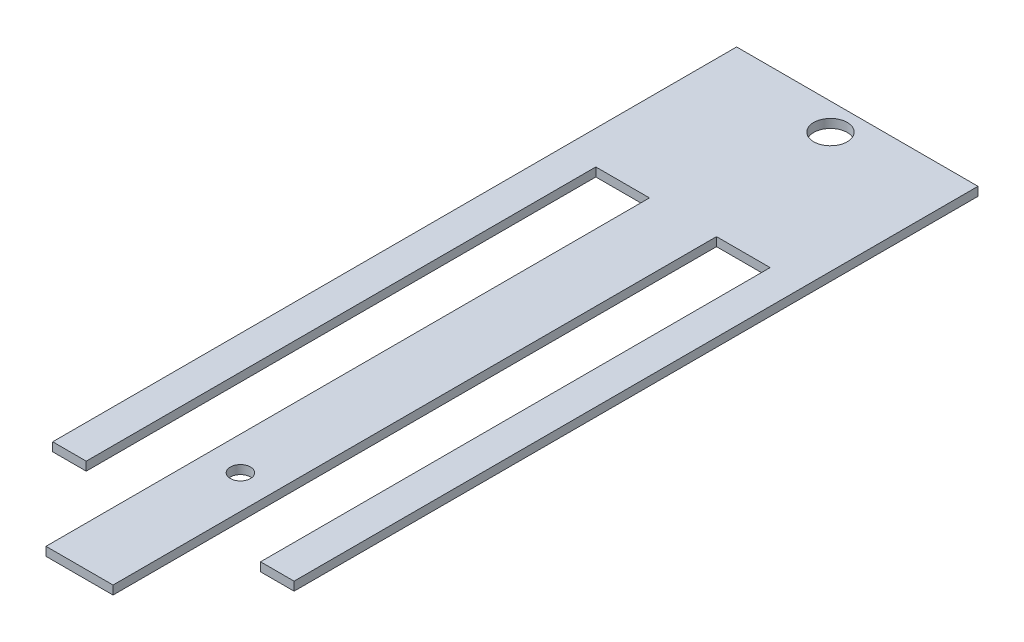
ISO-10303-21;
HEADER;
FILE_DESCRIPTION(('STEP AP214'),'2;1');
FILE_NAME('part.step','',(''),(''),'','','');
FILE_SCHEMA(('AUTOMOTIVE_DESIGN { 1 0 10303 214 1 1 1 1 }'));
ENDSEC;
DATA;
#1=APPLICATION_CONTEXT('core data for automotive mechanical design processes');
#2=APPLICATION_PROTOCOL_DEFINITION('international standard','automotive_design',2000,#1);
#3=PRODUCT_CONTEXT('',#1,'mechanical');
#4=PRODUCT('Part','Part','',(#3));
#5=PRODUCT_RELATED_PRODUCT_CATEGORY('part','',(#4));
#6=PRODUCT_DEFINITION_FORMATION('','',#4);
#7=PRODUCT_DEFINITION_CONTEXT('part definition',#1,'design');
#8=PRODUCT_DEFINITION('design','',#6,#7);
#9=PRODUCT_DEFINITION_SHAPE('','',#8);
#10=(LENGTH_UNIT() NAMED_UNIT(*) SI_UNIT(.MILLI.,.METRE.));
#11=(NAMED_UNIT(*) PLANE_ANGLE_UNIT() SI_UNIT($,.RADIAN.));
#12=(NAMED_UNIT(*) SI_UNIT($,.STERADIAN.) SOLID_ANGLE_UNIT());
#13=UNCERTAINTY_MEASURE_WITH_UNIT(LENGTH_MEASURE(1.E-05),#10,'distance_accuracy_value','');
#14=(GEOMETRIC_REPRESENTATION_CONTEXT(3) GLOBAL_UNCERTAINTY_ASSIGNED_CONTEXT((#13)) GLOBAL_UNIT_ASSIGNED_CONTEXT((#10,
#11,#12)) REPRESENTATION_CONTEXT('',''));
#15=CARTESIAN_POINT('',(0.,0.,0.));
#16=DIRECTION('',(0.,0.,1.));
#17=DIRECTION('',(1.,0.,0.));
#18=AXIS2_PLACEMENT_3D('',#15,#16,#17);
#19=CARTESIAN_POINT('',(-6.5,0.65,0.));
#20=DIRECTION('',(-1.,0.,0.));
#21=DIRECTION('',(0.,0.,1.));
#22=AXIS2_PLACEMENT_3D('',#19,#20,#21);
#23=PLANE('',#22);
#24=DIRECTION('',(0.,0.,-1.));
#25=VECTOR('',#24,1.);
#26=CARTESIAN_POINT('',(-6.5,0.,0.));
#27=LINE('',#26,#25);
#28=CARTESIAN_POINT('',(-6.5,0.,22.));
#29=VERTEX_POINT('',#28);
#30=CARTESIAN_POINT('',(-6.5,0.,-16.));
#31=VERTEX_POINT('',#30);
#32=EDGE_CURVE('E158',#29,#31,#27,.T.);
#33=ORIENTED_EDGE('',*,*,#32,.T.);
#34=DIRECTION('',(0.,-1.,0.));
#35=VECTOR('',#34,1.);
#36=CARTESIAN_POINT('',(-6.5,0.65,-16.));
#37=LINE('',#36,#35);
#38=CARTESIAN_POINT('',(-6.5,0.65,-16.));
#39=VERTEX_POINT('',#38);
#40=EDGE_CURVE('E11',#39,#31,#37,.T.);
#41=ORIENTED_EDGE('',*,*,#40,.F.);
#42=DIRECTION('',(0.,0.,-1.));
#43=VECTOR('',#42,1.);
#44=CARTESIAN_POINT('',(-6.5,0.65,0.));
#45=LINE('',#44,#43);
#46=CARTESIAN_POINT('',(-6.5,0.65,22.));
#47=VERTEX_POINT('',#46);
#48=EDGE_CURVE('E182',#47,#39,#45,.T.);
#49=ORIENTED_EDGE('',*,*,#48,.F.);
#50=DIRECTION('',(0.,-1.,0.));
#51=VECTOR('',#50,1.);
#52=CARTESIAN_POINT('',(-6.5,0.65,22.));
#53=LINE('',#52,#51);
#54=EDGE_CURVE('E154',#47,#29,#53,.T.);
#55=ORIENTED_EDGE('',*,*,#54,.T.);
#56=EDGE_LOOP('',(#33,#41,#49,#55));
#57=FACE_BOUND('',#56,.T.);
#58=ADVANCED_FACE('F37',(#57),#23,.F.);
#59=CARTESIAN_POINT('',(0.,0.65,-16.));
#60=DIRECTION('',(0.,0.,-1.));
#61=DIRECTION('',(-1.,0.,0.));
#62=AXIS2_PLACEMENT_3D('',#59,#60,#61);
#63=PLANE('',#62);
#64=DIRECTION('',(1.,0.,0.));
#65=VECTOR('',#64,1.);
#66=CARTESIAN_POINT('',(0.,0.,-16.));
#67=LINE('',#66,#65);
#68=CARTESIAN_POINT('',(-2.5,0.,-16.));
#69=VERTEX_POINT('',#68);
#70=EDGE_CURVE('E161',#31,#69,#67,.T.);
#71=ORIENTED_EDGE('',*,*,#70,.T.);
#72=DIRECTION('',(0.,-1.,0.));
#73=VECTOR('',#72,1.);
#74=CARTESIAN_POINT('',(-2.5,0.65,-16.));
#75=LINE('',#74,#73);
#76=CARTESIAN_POINT('',(-2.5,0.65,-16.));
#77=VERTEX_POINT('',#76);
#78=EDGE_CURVE('E46',#77,#69,#75,.T.);
#79=ORIENTED_EDGE('',*,*,#78,.F.);
#80=DIRECTION('',(1.,0.,0.));
#81=VECTOR('',#80,1.);
#82=CARTESIAN_POINT('',(0.,0.65,-16.));
#83=LINE('',#82,#81);
#84=EDGE_CURVE('E109',#39,#77,#83,.T.);
#85=ORIENTED_EDGE('',*,*,#84,.F.);
#86=ORIENTED_EDGE('',*,*,#40,.T.);
#87=EDGE_LOOP('',(#71,#79,#85,#86));
#88=FACE_BOUND('',#87,.T.);
#89=ADVANCED_FACE('F259',(#88),#63,.F.);
#90=CARTESIAN_POINT('',(-2.5,0.65,0.));
#91=DIRECTION('',(1.,0.,0.));
#92=DIRECTION('',(0.,0.,-1.));
#93=AXIS2_PLACEMENT_3D('',#90,#91,#92);
#94=PLANE('',#93);
#95=DIRECTION('',(0.,0.,1.));
#96=VECTOR('',#95,1.);
#97=CARTESIAN_POINT('',(-2.5,0.,0.));
#98=LINE('',#97,#96);
#99=CARTESIAN_POINT('',(-2.5,0.,29.));
#100=VERTEX_POINT('',#99);
#101=EDGE_CURVE('E163',#69,#100,#98,.T.);
#102=ORIENTED_EDGE('',*,*,#101,.T.);
#103=DIRECTION('',(0.,-1.,0.));
#104=VECTOR('',#103,1.);
#105=CARTESIAN_POINT('',(-2.5,0.65,29.));
#106=LINE('',#105,#104);
#107=CARTESIAN_POINT('',(-2.5,0.65,29.));
#108=VERTEX_POINT('',#107);
#109=EDGE_CURVE('E199',#108,#100,#106,.T.);
#110=ORIENTED_EDGE('',*,*,#109,.F.);
#111=DIRECTION('',(0.,0.,1.));
#112=VECTOR('',#111,1.);
#113=CARTESIAN_POINT('',(-2.5,0.65,0.));
#114=LINE('',#113,#112);
#115=EDGE_CURVE('E208',#77,#108,#114,.T.);
#116=ORIENTED_EDGE('',*,*,#115,.F.);
#117=ORIENTED_EDGE('',*,*,#78,.T.);
#118=EDGE_LOOP('',(#102,#110,#116,#117));
#119=FACE_BOUND('',#118,.T.);
#120=ADVANCED_FACE('F206',(#119),#94,.F.);
#121=CARTESIAN_POINT('',(0.,0.65,29.));
#122=DIRECTION('',(0.,0.,-1.));
#123=DIRECTION('',(-1.,0.,0.));
#124=AXIS2_PLACEMENT_3D('',#121,#122,#123);
#125=PLANE('',#124);
#126=DIRECTION('',(1.,0.,0.));
#127=VECTOR('',#126,1.);
#128=CARTESIAN_POINT('',(0.,0.,29.));
#129=LINE('',#128,#127);
#130=CARTESIAN_POINT('',(2.5,0.,29.));
#131=VERTEX_POINT('',#130);
#132=EDGE_CURVE('E165',#100,#131,#129,.T.);
#133=ORIENTED_EDGE('',*,*,#132,.T.);
#134=DIRECTION('',(0.,-1.,0.));
#135=VECTOR('',#134,1.);
#136=CARTESIAN_POINT('',(2.5,0.65,29.));
#137=LINE('',#136,#135);
#138=CARTESIAN_POINT('',(2.5,0.65,29.));
#139=VERTEX_POINT('',#138);
#140=EDGE_CURVE('E197',#139,#131,#137,.T.);
#141=ORIENTED_EDGE('',*,*,#140,.F.);
#142=DIRECTION('',(1.,0.,0.));
#143=VECTOR('',#142,1.);
#144=CARTESIAN_POINT('',(0.,0.65,29.));
#145=LINE('',#144,#143);
#146=EDGE_CURVE('E220',#108,#139,#145,.T.);
#147=ORIENTED_EDGE('',*,*,#146,.F.);
#148=ORIENTED_EDGE('',*,*,#109,.T.);
#149=EDGE_LOOP('',(#133,#141,#147,#148));
#150=FACE_BOUND('',#149,.T.);
#151=ADVANCED_FACE('F217',(#150),#125,.F.);
#152=CARTESIAN_POINT('',(2.5,0.65,0.));
#153=DIRECTION('',(1.,0.,0.));
#154=DIRECTION('',(0.,0.,-1.));
#155=AXIS2_PLACEMENT_3D('',#152,#153,#154);
#156=PLANE('',#155);
#157=DIRECTION('',(0.,0.,1.));
#158=VECTOR('',#157,1.);
#159=CARTESIAN_POINT('',(2.5,0.,0.));
#160=LINE('',#159,#158);
#161=CARTESIAN_POINT('',(2.5,0.,-16.));
#162=VERTEX_POINT('',#161);
#163=EDGE_CURVE('E168',#162,#131,#160,.T.);
#164=ORIENTED_EDGE('',*,*,#163,.F.);
#165=DIRECTION('',(0.,-1.,0.));
#166=VECTOR('',#165,1.);
#167=CARTESIAN_POINT('',(2.5,0.65,-16.));
#168=LINE('',#167,#166);
#169=CARTESIAN_POINT('',(2.5,0.65,-16.));
#170=VERTEX_POINT('',#169);
#171=EDGE_CURVE('E195',#170,#162,#168,.T.);
#172=ORIENTED_EDGE('',*,*,#171,.F.);
#173=DIRECTION('',(0.,0.,1.));
#174=VECTOR('',#173,1.);
#175=CARTESIAN_POINT('',(2.5,0.65,0.));
#176=LINE('',#175,#174);
#177=EDGE_CURVE('E222',#170,#139,#176,.T.);
#178=ORIENTED_EDGE('',*,*,#177,.T.);
#179=ORIENTED_EDGE('',*,*,#140,.T.);
#180=EDGE_LOOP('',(#164,#172,#178,#179));
#181=FACE_BOUND('',#180,.T.);
#182=ADVANCED_FACE('F270',(#181),#156,.T.);
#183=CARTESIAN_POINT('',(0.,0.65,-16.));
#184=DIRECTION('',(0.,0.,-1.));
#185=DIRECTION('',(-1.,0.,0.));
#186=AXIS2_PLACEMENT_3D('',#183,#184,#185);
#187=PLANE('',#186);
#188=DIRECTION('',(1.,0.,0.));
#189=VECTOR('',#188,1.);
#190=CARTESIAN_POINT('',(0.,0.,-16.));
#191=LINE('',#190,#189);
#192=CARTESIAN_POINT('',(6.49999999999999,0.,-16.));
#193=VERTEX_POINT('',#192);
#194=EDGE_CURVE('E171',#162,#193,#191,.T.);
#195=ORIENTED_EDGE('',*,*,#194,.T.);
#196=DIRECTION('',(0.,-1.,0.));
#197=VECTOR('',#196,1.);
#198=CARTESIAN_POINT('',(6.49999999999999,0.65,-16.));
#199=LINE('',#198,#197);
#200=CARTESIAN_POINT('',(6.49999999999999,0.65,-16.));
#201=VERTEX_POINT('',#200);
#202=EDGE_CURVE('E192',#201,#193,#199,.T.);
#203=ORIENTED_EDGE('',*,*,#202,.F.);
#204=DIRECTION('',(1.,0.,0.));
#205=VECTOR('',#204,1.);
#206=CARTESIAN_POINT('',(0.,0.65,-16.));
#207=LINE('',#206,#205);
#208=EDGE_CURVE('E224',#170,#201,#207,.T.);
#209=ORIENTED_EDGE('',*,*,#208,.F.);
#210=ORIENTED_EDGE('',*,*,#171,.T.);
#211=EDGE_LOOP('',(#195,#203,#209,#210));
#212=FACE_BOUND('',#211,.T.);
#213=ADVANCED_FACE('F273',(#212),#187,.F.);
#214=CARTESIAN_POINT('',(6.5,0.65,0.));
#215=DIRECTION('',(1.,0.,0.));
#216=DIRECTION('',(0.,0.,-1.));
#217=AXIS2_PLACEMENT_3D('',#214,#215,#216);
#218=PLANE('',#217);
#219=DIRECTION('',(0.,0.,1.));
#220=VECTOR('',#219,1.);
#221=CARTESIAN_POINT('',(6.5,0.,0.));
#222=LINE('',#221,#220);
#223=CARTESIAN_POINT('',(6.5,0.,22.));
#224=VERTEX_POINT('',#223);
#225=EDGE_CURVE('E173',#193,#224,#222,.T.);
#226=ORIENTED_EDGE('',*,*,#225,.T.);
#227=DIRECTION('',(0.,-1.,0.));
#228=VECTOR('',#227,1.);
#229=CARTESIAN_POINT('',(6.5,0.65,22.));
#230=LINE('',#229,#228);
#231=CARTESIAN_POINT('',(6.5,0.65,22.));
#232=VERTEX_POINT('',#231);
#233=EDGE_CURVE('E189',#232,#224,#230,.T.);
#234=ORIENTED_EDGE('',*,*,#233,.F.);
#235=DIRECTION('',(0.,0.,1.));
#236=VECTOR('',#235,1.);
#237=CARTESIAN_POINT('',(6.5,0.65,0.));
#238=LINE('',#237,#236);
#239=EDGE_CURVE('E230',#201,#232,#238,.T.);
#240=ORIENTED_EDGE('',*,*,#239,.F.);
#241=ORIENTED_EDGE('',*,*,#202,.T.);
#242=EDGE_LOOP('',(#226,#234,#240,#241));
#243=FACE_BOUND('',#242,.T.);
#244=ADVANCED_FACE('F277',(#243),#218,.F.);
#245=CARTESIAN_POINT('',(0.,0.65,22.));
#246=DIRECTION('',(0.,0.,-1.));
#247=DIRECTION('',(-1.,0.,0.));
#248=AXIS2_PLACEMENT_3D('',#245,#246,#247);
#249=PLANE('',#248);
#250=DIRECTION('',(1.,0.,0.));
#251=VECTOR('',#250,1.);
#252=CARTESIAN_POINT('',(0.,0.,22.));
#253=LINE('',#252,#251);
#254=CARTESIAN_POINT('',(9.,0.,22.));
#255=VERTEX_POINT('',#254);
#256=EDGE_CURVE('E175',#224,#255,#253,.T.);
#257=ORIENTED_EDGE('',*,*,#256,.T.);
#258=DIRECTION('',(0.,-1.,0.));
#259=VECTOR('',#258,1.);
#260=CARTESIAN_POINT('',(9.,0.65,22.));
#261=LINE('',#260,#259);
#262=CARTESIAN_POINT('',(9.,0.65,22.));
#263=VERTEX_POINT('',#262);
#264=EDGE_CURVE('E186',#263,#255,#261,.T.);
#265=ORIENTED_EDGE('',*,*,#264,.F.);
#266=DIRECTION('',(1.,0.,0.));
#267=VECTOR('',#266,1.);
#268=CARTESIAN_POINT('',(0.,0.65,22.));
#269=LINE('',#268,#267);
#270=EDGE_CURVE('E232',#232,#263,#269,.T.);
#271=ORIENTED_EDGE('',*,*,#270,.F.);
#272=ORIENTED_EDGE('',*,*,#233,.T.);
#273=EDGE_LOOP('',(#257,#265,#271,#272));
#274=FACE_BOUND('',#273,.T.);
#275=ADVANCED_FACE('F238',(#274),#249,.F.);
#276=CARTESIAN_POINT('',(9.,0.65,0.));
#277=DIRECTION('',(-1.,0.,0.));
#278=DIRECTION('',(0.,0.,1.));
#279=AXIS2_PLACEMENT_3D('',#276,#277,#278);
#280=PLANE('',#279);
#281=DIRECTION('',(0.,0.,-1.));
#282=VECTOR('',#281,1.);
#283=CARTESIAN_POINT('',(9.,0.,0.));
#284=LINE('',#283,#282);
#285=CARTESIAN_POINT('',(9.,0.,-29.));
#286=VERTEX_POINT('',#285);
#287=EDGE_CURVE('E177',#255,#286,#284,.T.);
#288=ORIENTED_EDGE('',*,*,#287,.T.);
#289=DIRECTION('',(0.,-1.,0.));
#290=VECTOR('',#289,1.);
#291=CARTESIAN_POINT('',(9.,0.65,-29.));
#292=LINE('',#291,#290);
#293=CARTESIAN_POINT('',(9.,0.65,-29.));
#294=VERTEX_POINT('',#293);
#295=EDGE_CURVE('E149',#294,#286,#292,.T.);
#296=ORIENTED_EDGE('',*,*,#295,.F.);
#297=DIRECTION('',(0.,0.,-1.));
#298=VECTOR('',#297,1.);
#299=CARTESIAN_POINT('',(9.,0.65,0.));
#300=LINE('',#299,#298);
#301=EDGE_CURVE('E140',#263,#294,#300,.T.);
#302=ORIENTED_EDGE('',*,*,#301,.F.);
#303=ORIENTED_EDGE('',*,*,#264,.T.);
#304=EDGE_LOOP('',(#288,#296,#302,#303));
#305=FACE_BOUND('',#304,.T.);
#306=ADVANCED_FACE('F242',(#305),#280,.F.);
#307=CARTESIAN_POINT('',(0.,0.65,-29.));
#308=DIRECTION('',(0.,0.,1.));
#309=DIRECTION('',(1.,0.,0.));
#310=AXIS2_PLACEMENT_3D('',#307,#308,#309);
#311=PLANE('',#310);
#312=DIRECTION('',(-1.,0.,0.));
#313=VECTOR('',#312,1.);
#314=CARTESIAN_POINT('',(0.,0.,-29.));
#315=LINE('',#314,#313);
#316=CARTESIAN_POINT('',(-9.,0.,-29.));
#317=VERTEX_POINT('',#316);
#318=EDGE_CURVE('E148',#286,#317,#315,.T.);
#319=ORIENTED_EDGE('',*,*,#318,.T.);
#320=DIRECTION('',(0.,-1.,0.));
#321=VECTOR('',#320,1.);
#322=CARTESIAN_POINT('',(-9.,0.65,-29.));
#323=LINE('',#322,#321);
#324=CARTESIAN_POINT('',(-9.,0.65,-29.));
#325=VERTEX_POINT('',#324);
#326=EDGE_CURVE('E145',#325,#317,#323,.T.);
#327=ORIENTED_EDGE('',*,*,#326,.F.);
#328=DIRECTION('',(-1.,0.,0.));
#329=VECTOR('',#328,1.);
#330=CARTESIAN_POINT('',(0.,0.65,-29.));
#331=LINE('',#330,#329);
#332=EDGE_CURVE('E134',#294,#325,#331,.T.);
#333=ORIENTED_EDGE('',*,*,#332,.F.);
#334=ORIENTED_EDGE('',*,*,#295,.T.);
#335=EDGE_LOOP('',(#319,#327,#333,#334));
#336=FACE_BOUND('',#335,.T.);
#337=ADVANCED_FACE('F146',(#336),#311,.F.);
#338=CARTESIAN_POINT('',(-9.,0.65,0.));
#339=DIRECTION('',(1.,0.,0.));
#340=DIRECTION('',(0.,0.,-1.));
#341=AXIS2_PLACEMENT_3D('',#338,#339,#340);
#342=PLANE('',#341);
#343=DIRECTION('',(0.,0.,1.));
#344=VECTOR('',#343,1.);
#345=CARTESIAN_POINT('',(-9.,0.,0.));
#346=LINE('',#345,#344);
#347=CARTESIAN_POINT('',(-9.,0.,22.));
#348=VERTEX_POINT('',#347);
#349=EDGE_CURVE('E95',#317,#348,#346,.T.);
#350=ORIENTED_EDGE('',*,*,#349,.T.);
#351=DIRECTION('',(0.,-1.,0.));
#352=VECTOR('',#351,1.);
#353=CARTESIAN_POINT('',(-9.,0.65,22.));
#354=LINE('',#353,#352);
#355=CARTESIAN_POINT('',(-9.,0.65,22.));
#356=VERTEX_POINT('',#355);
#357=EDGE_CURVE('E150',#356,#348,#354,.T.);
#358=ORIENTED_EDGE('',*,*,#357,.F.);
#359=DIRECTION('',(0.,0.,1.));
#360=VECTOR('',#359,1.);
#361=CARTESIAN_POINT('',(-9.,0.65,0.));
#362=LINE('',#361,#360);
#363=EDGE_CURVE('E138',#325,#356,#362,.T.);
#364=ORIENTED_EDGE('',*,*,#363,.F.);
#365=ORIENTED_EDGE('',*,*,#326,.T.);
#366=EDGE_LOOP('',(#350,#358,#364,#365));
#367=FACE_BOUND('',#366,.T.);
#368=ADVANCED_FACE('F152',(#367),#342,.F.);
#369=CARTESIAN_POINT('',(0.,0.65,22.));
#370=DIRECTION('',(0.,0.,-1.));
#371=DIRECTION('',(-1.,0.,0.));
#372=AXIS2_PLACEMENT_3D('',#369,#370,#371);
#373=PLANE('',#372);
#374=DIRECTION('',(1.,0.,0.));
#375=VECTOR('',#374,1.);
#376=CARTESIAN_POINT('',(0.,0.,22.));
#377=LINE('',#376,#375);
#378=EDGE_CURVE('E101',#348,#29,#377,.T.);
#379=ORIENTED_EDGE('',*,*,#378,.T.);
#380=ORIENTED_EDGE('',*,*,#54,.F.);
#381=DIRECTION('',(1.,0.,0.));
#382=VECTOR('',#381,1.);
#383=CARTESIAN_POINT('',(0.,0.65,22.));
#384=LINE('',#383,#382);
#385=EDGE_CURVE('E54',#356,#47,#384,.T.);
#386=ORIENTED_EDGE('',*,*,#385,.F.);
#387=ORIENTED_EDGE('',*,*,#357,.T.);
#388=EDGE_LOOP('',(#379,#380,#386,#387));
#389=FACE_BOUND('',#388,.T.);
#390=ADVANCED_FACE('F246',(#389),#373,.F.);
#391=CARTESIAN_POINT('',(0.,0.65,0.));
#392=DIRECTION('',(0.,1.,0.));
#393=DIRECTION('',(0.,0.,1.));
#394=AXIS2_PLACEMENT_3D('',#391,#392,#393);
#395=PLANE('',#394);
#396=CARTESIAN_POINT('',(0.,0.65,17.));
#397=DIRECTION('',(0.,1.,0.));
#398=DIRECTION('',(0.,0.,1.));
#399=AXIS2_PLACEMENT_3D('',#396,#397,#398);
#400=CIRCLE('',#399,0.75);
#401=CARTESIAN_POINT('',(0.,0.65,17.75));
#402=VERTEX_POINT('',#401);
#403=EDGE_CURVE('E336',#402,#402,#400,.T.);
#404=ORIENTED_EDGE('',*,*,#403,.F.);
#405=EDGE_LOOP('',(#404));
#406=FACE_BOUND('',#405,.T.);
#407=CARTESIAN_POINT('',(0.,0.65,-27.));
#408=DIRECTION('',(0.,1.,0.));
#409=DIRECTION('',(0.,0.,1.));
#410=AXIS2_PLACEMENT_3D('',#407,#408,#409);
#411=CIRCLE('',#410,1.25);
#412=CARTESIAN_POINT('',(0.,0.65,-25.75));
#413=VERTEX_POINT('',#412);
#414=EDGE_CURVE('E341',#413,#413,#411,.T.);
#415=ORIENTED_EDGE('',*,*,#414,.F.);
#416=EDGE_LOOP('',(#415));
#417=FACE_BOUND('',#416,.T.);
#418=ORIENTED_EDGE('',*,*,#48,.T.);
#419=ORIENTED_EDGE('',*,*,#84,.T.);
#420=ORIENTED_EDGE('',*,*,#115,.T.);
#421=ORIENTED_EDGE('',*,*,#146,.T.);
#422=ORIENTED_EDGE('',*,*,#177,.F.);
#423=ORIENTED_EDGE('',*,*,#208,.T.);
#424=ORIENTED_EDGE('',*,*,#239,.T.);
#425=ORIENTED_EDGE('',*,*,#270,.T.);
#426=ORIENTED_EDGE('',*,*,#301,.T.);
#427=ORIENTED_EDGE('',*,*,#332,.T.);
#428=ORIENTED_EDGE('',*,*,#363,.T.);
#429=ORIENTED_EDGE('',*,*,#385,.T.);
#430=EDGE_LOOP('',(#418,#419,#420,#421,#422,#423,#424,#425,#426,#427,#428,#429));
#431=FACE_BOUND('',#430,.T.);
#432=ADVANCED_FACE('F136',(#406,#417,#431),#395,.T.);
#433=CARTESIAN_POINT('',(0.,0.,0.));
#434=DIRECTION('',(0.,1.,0.));
#435=DIRECTION('',(0.,0.,1.));
#436=AXIS2_PLACEMENT_3D('',#433,#434,#435);
#437=PLANE('',#436);
#438=CARTESIAN_POINT('',(0.,0.,17.));
#439=DIRECTION('',(0.,-1.,0.));
#440=DIRECTION('',(0.,0.,-1.));
#441=AXIS2_PLACEMENT_3D('',#438,#439,#440);
#442=CIRCLE('',#441,0.75);
#443=CARTESIAN_POINT('',(0.,0.,16.25));
#444=VERTEX_POINT('',#443);
#445=EDGE_CURVE('E339',#444,#444,#442,.T.);
#446=ORIENTED_EDGE('',*,*,#445,.F.);
#447=EDGE_LOOP('',(#446));
#448=FACE_BOUND('',#447,.T.);
#449=CARTESIAN_POINT('',(0.,0.,-27.));
#450=DIRECTION('',(0.,1.,0.));
#451=DIRECTION('',(0.,0.,1.));
#452=AXIS2_PLACEMENT_3D('',#449,#450,#451);
#453=CIRCLE('',#452,1.25);
#454=CARTESIAN_POINT('',(0.,0.,-25.75));
#455=VERTEX_POINT('',#454);
#456=EDGE_CURVE('E40',#455,#455,#453,.T.);
#457=ORIENTED_EDGE('',*,*,#456,.T.);
#458=EDGE_LOOP('',(#457));
#459=FACE_BOUND('',#458,.T.);
#460=ORIENTED_EDGE('',*,*,#32,.F.);
#461=ORIENTED_EDGE('',*,*,#378,.F.);
#462=ORIENTED_EDGE('',*,*,#349,.F.);
#463=ORIENTED_EDGE('',*,*,#318,.F.);
#464=ORIENTED_EDGE('',*,*,#287,.F.);
#465=ORIENTED_EDGE('',*,*,#256,.F.);
#466=ORIENTED_EDGE('',*,*,#225,.F.);
#467=ORIENTED_EDGE('',*,*,#194,.F.);
#468=ORIENTED_EDGE('',*,*,#163,.T.);
#469=ORIENTED_EDGE('',*,*,#132,.F.);
#470=ORIENTED_EDGE('',*,*,#101,.F.);
#471=ORIENTED_EDGE('',*,*,#70,.F.);
#472=EDGE_LOOP('',(#460,#461,#462,#463,#464,#465,#466,#467,#468,#469,#470,#471));
#473=FACE_BOUND('',#472,.T.);
#474=ADVANCED_FACE('F212',(#448,#459,#473),#437,.F.);
#475=CARTESIAN_POINT('',(0.,-9.35,-27.));
#476=DIRECTION('',(0.,1.,0.));
#477=DIRECTION('',(0.,0.,1.));
#478=AXIS2_PLACEMENT_3D('',#475,#476,#477);
#479=CYLINDRICAL_SURFACE('',#478,1.25);
#480=ORIENTED_EDGE('',*,*,#414,.T.);
#481=EDGE_LOOP('',(#480));
#482=FACE_BOUND('',#481,.T.);
#483=ORIENTED_EDGE('',*,*,#456,.F.);
#484=EDGE_LOOP('',(#483));
#485=FACE_BOUND('',#484,.T.);
#486=ADVANCED_FACE('F305',(#482,#485),#479,.F.);
#487=CARTESIAN_POINT('',(0.,10.,17.));
#488=DIRECTION('',(0.,-1.,0.));
#489=DIRECTION('',(0.,0.,-1.));
#490=AXIS2_PLACEMENT_3D('',#487,#488,#489);
#491=CYLINDRICAL_SURFACE('',#490,0.75);
#492=ORIENTED_EDGE('',*,*,#403,.T.);
#493=EDGE_LOOP('',(#492));
#494=FACE_BOUND('',#493,.T.);
#495=ORIENTED_EDGE('',*,*,#445,.T.);
#496=EDGE_LOOP('',(#495));
#497=FACE_BOUND('',#496,.T.);
#498=ADVANCED_FACE('F309',(#494,#497),#491,.F.);
#499=CLOSED_SHELL('',(#58,#89,#120,#151,#182,#213,#244,#275,#306,#337,#368,#390,#432,#474,#486,#498));
#500=MANIFOLD_SOLID_BREP('B2',#499);
#501=ADVANCED_BREP_SHAPE_REPRESENTATION('',(#18,#500),#14);
#502=SHAPE_DEFINITION_REPRESENTATION(#9,#501);
ENDSEC;
END-ISO-10303-21;
